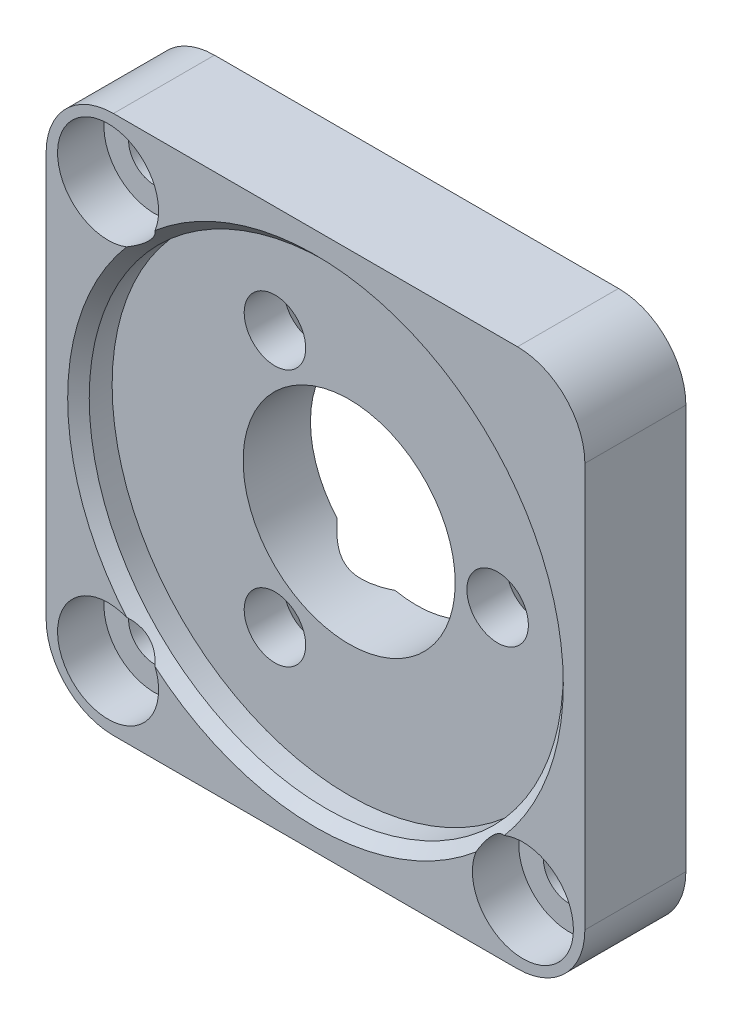
ISO-10303-21;
HEADER;
FILE_DESCRIPTION(('STEP AP214'),'2;1');
FILE_NAME('part.step','',(''),(''),'','','');
FILE_SCHEMA(('AUTOMOTIVE_DESIGN { 1 0 10303 214 1 1 1 1 }'));
ENDSEC;
DATA;
#1=APPLICATION_CONTEXT('core data for automotive mechanical design processes');
#2=APPLICATION_PROTOCOL_DEFINITION('international standard','automotive_design',2000,#1);
#3=PRODUCT_CONTEXT('',#1,'mechanical');
#4=PRODUCT('Part','Part','',(#3));
#5=PRODUCT_RELATED_PRODUCT_CATEGORY('part','',(#4));
#6=PRODUCT_DEFINITION_FORMATION('','',#4);
#7=PRODUCT_DEFINITION_CONTEXT('part definition',#1,'design');
#8=PRODUCT_DEFINITION('design','',#6,#7);
#9=PRODUCT_DEFINITION_SHAPE('','',#8);
#10=(LENGTH_UNIT() NAMED_UNIT(*) SI_UNIT(.MILLI.,.METRE.));
#11=(NAMED_UNIT(*) PLANE_ANGLE_UNIT() SI_UNIT($,.RADIAN.));
#12=(NAMED_UNIT(*) SI_UNIT($,.STERADIAN.) SOLID_ANGLE_UNIT());
#13=UNCERTAINTY_MEASURE_WITH_UNIT(LENGTH_MEASURE(1.E-05),#10,'distance_accuracy_value','');
#14=(GEOMETRIC_REPRESENTATION_CONTEXT(3) GLOBAL_UNCERTAINTY_ASSIGNED_CONTEXT((#13)) GLOBAL_UNIT_ASSIGNED_CONTEXT((#10,
#11,#12)) REPRESENTATION_CONTEXT('',''));
#15=CARTESIAN_POINT('',(0.,0.,0.));
#16=DIRECTION('',(0.,0.,1.));
#17=DIRECTION('',(1.,0.,0.));
#18=AXIS2_PLACEMENT_3D('',#15,#16,#17);
#19=CARTESIAN_POINT('',(0.,0.,0.));
#20=DIRECTION('',(0.,0.,1.));
#21=DIRECTION('',(1.,0.,0.));
#22=AXIS2_PLACEMENT_3D('',#19,#20,#21);
#23=CYLINDRICAL_SURFACE('',#22,5.);
#24=CARTESIAN_POINT('',(0.,0.,0.));
#25=DIRECTION('',(0.,0.,1.));
#26=DIRECTION('',(1.,0.,0.));
#27=AXIS2_PLACEMENT_3D('',#24,#25,#26);
#28=CIRCLE('',#27,5.);
#29=CARTESIAN_POINT('',(4.7455357142857,1.57476689844525,0.));
#30=VERTEX_POINT('',#29);
#31=CARTESIAN_POINT('',(-1.00897971805046,4.89713793236037,0.));
#32=VERTEX_POINT('',#31);
#33=EDGE_CURVE('E153',#30,#32,#28,.T.);
#34=ORIENTED_EDGE('',*,*,#33,.F.);
#35=CARTESIAN_POINT('',(4.74545713999999,1.57500366108245,-0.00020000000000202));
#36=CARTESIAN_POINT('',(4.76552764029645,1.51449201081971,0.050857437708633));
#37=CARTESIAN_POINT('',(4.7846905441715,1.45292141588944,0.101081569057024));
#38=CARTESIAN_POINT('',(4.82113131529227,1.32704022235563,0.199208084636068));
#39=CARTESIAN_POINT('',(4.83840194452243,1.26272032746794,0.247101189452153));
#40=CARTESIAN_POINT('',(4.87129986426245,1.12928597912404,0.340836981811573));
#41=CARTESIAN_POINT('',(4.88686630182077,1.06008712899437,0.386582349971828));
#42=CARTESIAN_POINT('',(4.91550203129823,0.918188654262139,0.472977295465216));
#43=CARTESIAN_POINT('',(4.92857514537635,0.845494605395758,0.51363463908094));
#44=CARTESIAN_POINT('',(4.95280341966186,0.690211548889723,0.590753024415545));
#45=CARTESIAN_POINT('',(4.96372916996901,0.607293104967135,0.626638669126483));
#46=CARTESIAN_POINT('',(4.98156782915352,0.437249254180743,0.68627598239686));
#47=CARTESIAN_POINT('',(4.98851001775224,0.350159777885404,0.710116028591315));
#48=CARTESIAN_POINT('',(4.99551452281616,0.216523557129883,0.73434653523121));
#49=CARTESIAN_POINT('',(4.99728125103068,0.171084235238875,0.740503371873505));
#50=CARTESIAN_POINT('',(4.99957142855513,0.079787252951217,0.74849613308357));
#51=CARTESIAN_POINT('',(5.00009499863555,0.0339296336259222,0.750332477379014));
#52=CARTESIAN_POINT('',(4.99987663666279,-0.0577475674176241,0.749568247437993));
#53=CARTESIAN_POINT('',(4.99913463306999,-0.103567146839095,0.746967422379725));
#54=CARTESIAN_POINT('',(4.99641515830057,-0.194735342049909,0.737487055591618));
#55=CARTESIAN_POINT('',(4.99443700942246,-0.240083685616463,0.730605166830416));
#56=CARTESIAN_POINT('',(4.98613850030061,-0.385337562601037,0.701961111322438));
#57=CARTESIAN_POINT('',(4.97747133271156,-0.483592924539697,0.672313168311543));
#58=CARTESIAN_POINT('',(4.95523473097507,-0.674574721890798,0.598711818835299));
#59=CARTESIAN_POINT('',(4.9416241272002,-0.767246870771934,0.554638590636629));
#60=CARTESIAN_POINT('',(4.91453775100104,-0.922920975830143,0.470138280685812));
#61=CARTESIAN_POINT('',(4.90198195816715,-0.987277891700082,0.431839748716554));
#62=CARTESIAN_POINT('',(4.87491803739937,-1.11325216235572,0.351508884111785));
#63=CARTESIAN_POINT('',(4.86040828407791,-1.17486717892545,0.309473452965235));
#64=CARTESIAN_POINT('',(4.83001826870802,-1.29406695461802,0.223831671961862));
#65=CARTESIAN_POINT('',(4.81418441437144,-1.35171521044422,0.180296292882237));
#66=CARTESIAN_POINT('',(4.78096475207525,-1.46486295912579,0.0913365391103757));
#67=CARTESIAN_POINT('',(4.76358245335927,-1.52036692163019,0.0459165544142633));
#68=CARTESIAN_POINT('',(4.74545714000001,-1.57500366108238,-0.000200000000000358));
#69=B_SPLINE_CURVE_WITH_KNOTS('',3,(#35,#36,#37,#38,#39,#40,#41,#42,#43,#44,#45,#46,#47,#48,#49,
#50,#51,#52,#53,#54,#55,#56,#57,#58,#59,#60,#61,#62,#63,#64,#65,#66,#67,#68),.UNSPECIFIED.,.F.,
.F.,(4,2,2,2,2,2,2,2,2,2,2,2,2,2,2,2,4),(0.,0.245079278068307,0.491065475204198,
0.74406131750005,0.996666154522853,1.26899156999665,1.53928883597289,1.6767603437754,
1.81421849592898,1.95168441849679,2.08922577127056,2.39629939428319,2.70599131704176,
2.93361902569863,3.16143726809206,3.38322900447651,3.60453029505814),.UNSPECIFIED.);
#70=CARTESIAN_POINT('',(4.74553571428573,-1.57476689844518,0.));
#71=VERTEX_POINT('',#70);
#72=EDGE_CURVE('E139',#30,#71,#69,.T.);
#73=ORIENTED_EDGE('',*,*,#72,.T.);
#74=CARTESIAN_POINT('',(-1.00897971805046,-4.89713793236037,0.));
#75=VERTEX_POINT('',#74);
#76=EDGE_CURVE('E156',#75,#71,#28,.T.);
#77=ORIENTED_EDGE('',*,*,#76,.F.);
#78=CARTESIAN_POINT('',(-1.0087353884491,-4.89718826635146,-0.000200000000020371));
#79=CARTESIAN_POINT('',(-1.07117526494978,-4.88431400434349,0.0508574377086147));
#80=CARTESIAN_POINT('',(-1.13407841622304,-4.87012426844443,0.101081569057007));
#81=CARTESIAN_POINT('',(-1.26131511324242,-4.8387423052016,0.199208084636052));
#82=CARTESIAN_POINT('',(-1.32565309079897,-4.82153916141042,0.247101189452138));
#83=CARTESIAN_POINT('',(-1.45765958607223,-4.78331242146499,0.340836981811559));
#84=CARTESIAN_POINT('',(-1.52537076697635,-4.76219392677208,0.386582349971815));
#85=CARTESIAN_POINT('',(-1.66257631559146,-4.71604395858935,0.472977295465204));
#86=CARTESIAN_POINT('',(-1.73206776565276,-4.69101858305438,0.513634639080929));
#87=CARTESIAN_POINT('',(-1.87866097450703,-4.63435935582247,0.590753024415536));
#88=CARTESIAN_POINT('',(-1.95593332853984,-4.60236211118257,0.626638669126476));
#89=CARTESIAN_POINT('',(-2.11211495267044,-4.53278891781262,0.686275982396854));
#90=CARTESIAN_POINT('',(-2.19100774584385,-4.49525629134929,0.71011602859131));
#91=CARTESIAN_POINT('',(-2.31024236041584,-4.43450426029783,0.734346535231206));
#92=CARTESIAN_POINT('',(-2.35047733161145,-4.41331463086769,0.740503371873502));
#93=CARTESIAN_POINT('',(-2.43068792632364,-4.3696494916392,0.748496133083569));
#94=CARTESIAN_POINT('',(-2.47066357465664,-4.34717410696686,0.750332477379013));
#95=CARTESIAN_POINT('',(-2.54994917872182,-4.30114639942946,0.749568247437993));
#96=CARTESIAN_POINT('',(-2.58925909669513,-4.27759401575765,0.746967422379726));
#97=CARTESIAN_POINT('',(-2.66685333238017,-4.22965478391698,0.73748705559162));
#98=CARTESIAN_POINT('',(-2.7051370754893,-4.20526748495279,0.730605166830417));
#99=CARTESIAN_POINT('',(-2.82678136839519,-4.12545382674744,0.701961111322439));
#100=CARTESIAN_POINT('',(-2.90753942409758,-4.06882015846714,0.672313168311545));
#101=CARTESIAN_POINT('',(-3.0618162113958,-3.95407179779395,0.598711818835303));
#102=CARTESIAN_POINT('',(-3.13526734466272,-3.8959485947235,0.554638590636633));
#103=CARTESIAN_POINT('',(-3.25654188625496,-3.79465405230946,0.470138280685815));
#104=CARTESIAN_POINT('',(-3.3059987138906,-3.75160195881569,0.431839748716555));
#105=CARTESIAN_POINT('',(-3.40156367211772,-3.66517678057695,0.351508884111781));
#106=CARTESIAN_POINT('',(-3.44766896506098,-3.62180345731305,0.309473452965228));
#107=CARTESIAN_POINT('',(-3.53570399125121,-3.53588504413504,0.223831671961849));
#108=CARTESIAN_POINT('',(-3.57771191811228,-3.49334839612664,0.180296292882222));
#109=CARTESIAN_POINT('',(-3.65909091170344,-3.40800545033221,0.0913365391103537));
#110=CARTESIAN_POINT('',(-3.69846760388496,-3.36519995681579,0.0459165544142379));
#111=CARTESIAN_POINT('',(-3.73672175155088,-3.32218460526902,-0.000200000000029382));
#112=B_SPLINE_CURVE_WITH_KNOTS('',3,(#78,#79,#80,#81,#82,#83,#84,#85,#86,#87,#88,#89,#90,#91,
#92,#93,#94,#95,#96,#97,#98,#99,#100,#101,#102,#103,#104,#105,#106,#107,#108,#109,#110,#111),
.UNSPECIFIED.,.F.,.F.,(4,2,2,2,2,2,2,2,2,2,2,2,2,2,2,2,4),(0.,0.245079278068308,
0.491065475204202,0.744061317500056,0.996666154522861,1.26899156999667,1.5392888359729,
1.67676034377542,1.81421849592899,1.9516844184968,2.08922577127058,2.39629939428321,
2.70599131704178,2.93361902569865,3.1614372680921,3.38322900447656,3.60453029505821),.UNSPECIFIED.);
#113=CARTESIAN_POINT('',(-3.73655599623524,-3.32237103391516,0.));
#114=VERTEX_POINT('',#113);
#115=EDGE_CURVE('E148',#75,#114,#112,.T.);
#116=ORIENTED_EDGE('',*,*,#115,.T.);
#117=CARTESIAN_POINT('',(-3.73655599623524,3.32237103391516,0.));
#118=VERTEX_POINT('',#117);
#119=EDGE_CURVE('E166',#118,#114,#28,.T.);
#120=ORIENTED_EDGE('',*,*,#119,.F.);
#121=CARTESIAN_POINT('',(-3.73672175155088,3.32218460526902,-0.000200000000029231));
#122=CARTESIAN_POINT('',(-3.69435237534666,3.36982199352379,0.0508574377086064));
#123=CARTESIAN_POINT('',(-3.65061212794845,3.417202852555,0.101081569056999));
#124=CARTESIAN_POINT('',(-3.55981620204985,3.51170208284599,0.199208084636045));
#125=CARTESIAN_POINT('',(-3.51274885372345,3.55881883394249,0.247101189452131));
#126=CARTESIAN_POINT('',(-3.41364027819021,3.65402644234096,0.340836981811553));
#127=CARTESIAN_POINT('',(-3.36149553484441,3.70210679777773,0.386582349971809));
#128=CARTESIAN_POINT('',(-3.25292571570676,3.79785530432722,0.4729772954652));
#129=CARTESIAN_POINT('',(-3.19650737972359,3.84552397765864,0.513634639080924));
#130=CARTESIAN_POINT('',(-3.07414244515482,3.94414780693276,0.590753024415532));
#131=CARTESIAN_POINT('',(-3.00779584142916,3.99506900621545,0.626638669126473));
#132=CARTESIAN_POINT('',(-2.86945287648307,4.09553966363189,0.686275982396852));
#133=CARTESIAN_POINT('',(-2.79750227190837,4.14509651346391,0.710116028591308));
#134=CARTESIAN_POINT('',(-2.68527216240031,4.21798070316796,0.734346535231205));
#135=CARTESIAN_POINT('',(-2.64680391941922,4.24223039562883,0.740503371873501));
#136=CARTESIAN_POINT('',(-2.56888350223147,4.289862238688,0.748496133083569));
#137=CARTESIAN_POINT('',(-2.5294314239789,4.31324447334095,0.750332477379014));
#138=CARTESIAN_POINT('',(-2.44992745794096,4.3588939668471,0.749568247437994));
#139=CARTESIAN_POINT('',(-2.40987553637484,4.38116116259677,0.746967422379727));
#140=CARTESIAN_POINT('',(-2.32956182592039,4.42439012596691,0.737487055591621));
#141=CARTESIAN_POINT('',(-2.28929993393315,4.44535117056928,0.730605166830419));
#142=CARTESIAN_POINT('',(-2.1593571319054,4.5107913893485,0.701961111322442));
#143=CARTESIAN_POINT('',(-2.06993190861397,4.55241308300686,0.672313168311549));
#144=CARTESIAN_POINT('',(-1.89341851957926,4.62864651968477,0.598711818835308));
#145=CARTESIAN_POINT('',(-1.80635678253746,4.66319546549545,0.554638590636638));
#146=CARTESIAN_POINT('',(-1.65799586474606,4.71757502813962,0.470138280685821));
#147=CARTESIAN_POINT('',(-1.59598324427653,4.73887985051579,0.431839748716561));
#148=CARTESIAN_POINT('',(-1.47335436528163,4.7784289429327,0.351508884111788));
#149=CARTESIAN_POINT('',(-1.41273931901691,4.79667063623854,0.309473452965235));
#150=CARTESIAN_POINT('',(-1.29431427745679,4.82995199875311,0.223831671961857));
#151=CARTESIAN_POINT('',(-1.23647249625914,4.84506360657091,0.180296292882229));
#152=CARTESIAN_POINT('',(-1.12187384037178,4.87286840945805,0.0913365391103621));
#153=CARTESIAN_POINT('',(-1.06511484947427,4.88556687844604,0.0459165544142466));
#154=CARTESIAN_POINT('',(-1.0087353884491,4.89718826635146,-0.000200000000020631));
#155=B_SPLINE_CURVE_WITH_KNOTS('',3,(#121,#122,#123,#124,#125,#126,#127,#128,#129,#130,#131,
#132,#133,#134,#135,#136,#137,#138,#139,#140,#141,#142,#143,#144,#145,#146,#147,#148,#149,#150,
#151,#152,#153,#154),.UNSPECIFIED.,.F.,.F.,(4,2,2,2,2,2,2,2,2,2,2,2,2,2,2,2,4),(0.,
0.24507927806831,0.491065475204204,0.744061317500059,0.996666154522866,1.26899156999667,
1.53928883597291,1.67676034377542,1.814218495929,1.95168441849681,2.08922577127058,
2.39629939428321,2.70599131704178,2.93361902569866,3.16143726809211,3.38322900447657,
3.60453029505821),.UNSPECIFIED.);
#156=EDGE_CURVE('E163',#118,#32,#155,.T.);
#157=ORIENTED_EDGE('',*,*,#156,.T.);
#158=EDGE_LOOP('',(#34,#73,#77,#116,#120,#157));
#159=FACE_BOUND('',#158,.T.);
#160=CARTESIAN_POINT('',(0.,0.,3.175));
#161=DIRECTION('',(0.,0.,1.));
#162=DIRECTION('',(1.,0.,0.));
#163=AXIS2_PLACEMENT_3D('',#160,#161,#162);
#164=CIRCLE('',#163,5.);
#165=CARTESIAN_POINT('',(5.,0.,3.175));
#166=VERTEX_POINT('',#165);
#167=EDGE_CURVE('E158',#166,#166,#164,.F.);
#168=ORIENTED_EDGE('',*,*,#167,.F.);
#169=EDGE_LOOP('',(#168));
#170=FACE_BOUND('',#169,.T.);
#171=ADVANCED_FACE('F35',(#159,#170),#23,.F.);
#172=CARTESIAN_POINT('',(-3.49999999999998,6.06217782649108,0.));
#173=DIRECTION('',(0.,0.,-1.));
#174=DIRECTION('',(-1.,0.,0.));
#175=AXIS2_PLACEMENT_3D('',#172,#173,#174);
#176=CYLINDRICAL_SURFACE('',#175,1.44999999999999);
#177=CARTESIAN_POINT('',(-3.49999999999998,6.06217782649108,1.30000000000001));
#178=DIRECTION('',(0.,0.,-1.));
#179=DIRECTION('',(-1.,0.,0.));
#180=AXIS2_PLACEMENT_3D('',#177,#178,#179);
#181=CIRCLE('',#180,1.44999999999999);
#182=CARTESIAN_POINT('',(-4.94999999999998,6.06217782649108,1.30000000000001));
#183=VERTEX_POINT('',#182);
#184=EDGE_CURVE('E164',#183,#183,#181,.T.);
#185=ORIENTED_EDGE('',*,*,#184,.T.);
#186=EDGE_LOOP('',(#185));
#187=FACE_BOUND('',#186,.T.);
#188=CARTESIAN_POINT('',(-3.49999999999998,6.06217782649108,3.175));
#189=DIRECTION('',(0.,0.,1.));
#190=DIRECTION('',(1.,0.,0.));
#191=AXIS2_PLACEMENT_3D('',#188,#189,#190);
#192=CIRCLE('',#191,1.44999999999999);
#193=CARTESIAN_POINT('',(-2.04999999999999,6.06217782649108,3.175));
#194=VERTEX_POINT('',#193);
#195=EDGE_CURVE('E225',#194,#194,#192,.F.);
#196=ORIENTED_EDGE('',*,*,#195,.F.);
#197=EDGE_LOOP('',(#196));
#198=FACE_BOUND('',#197,.T.);
#199=ADVANCED_FACE('F210',(#187,#198),#176,.F.);
#200=CARTESIAN_POINT('',(-3.49999999999999,-6.06217782649108,0.));
#201=DIRECTION('',(0.,0.,-1.));
#202=DIRECTION('',(-1.,0.,0.));
#203=AXIS2_PLACEMENT_3D('',#200,#201,#202);
#204=CYLINDRICAL_SURFACE('',#203,1.44999999999999);
#205=CARTESIAN_POINT('',(-3.49999999999999,-6.06217782649108,1.30000000000001));
#206=DIRECTION('',(0.,0.,-1.));
#207=DIRECTION('',(-1.,0.,0.));
#208=AXIS2_PLACEMENT_3D('',#205,#206,#207);
#209=CIRCLE('',#208,1.44999999999999);
#210=CARTESIAN_POINT('',(-4.94999999999998,-6.06217782649108,1.30000000000001));
#211=VERTEX_POINT('',#210);
#212=EDGE_CURVE('E240',#211,#211,#209,.T.);
#213=ORIENTED_EDGE('',*,*,#212,.T.);
#214=EDGE_LOOP('',(#213));
#215=FACE_BOUND('',#214,.T.);
#216=CARTESIAN_POINT('',(-3.49999999999999,-6.06217782649108,3.175));
#217=DIRECTION('',(0.,0.,1.));
#218=DIRECTION('',(1.,0.,0.));
#219=AXIS2_PLACEMENT_3D('',#216,#217,#218);
#220=CIRCLE('',#219,1.44999999999999);
#221=CARTESIAN_POINT('',(-2.04999999999999,-6.06217782649108,3.175));
#222=VERTEX_POINT('',#221);
#223=EDGE_CURVE('E227',#222,#222,#220,.F.);
#224=ORIENTED_EDGE('',*,*,#223,.F.);
#225=EDGE_LOOP('',(#224));
#226=FACE_BOUND('',#225,.T.);
#227=ADVANCED_FACE('F212',(#215,#226),#204,.F.);
#228=CARTESIAN_POINT('',(7.,0.,0.));
#229=DIRECTION('',(0.,0.,-1.));
#230=DIRECTION('',(-1.,0.,0.));
#231=AXIS2_PLACEMENT_3D('',#228,#229,#230);
#232=CYLINDRICAL_SURFACE('',#231,1.44999999999999);
#233=CARTESIAN_POINT('',(7.,0.,1.30000000000001));
#234=DIRECTION('',(0.,0.,-1.));
#235=DIRECTION('',(-1.,0.,0.));
#236=AXIS2_PLACEMENT_3D('',#233,#234,#235);
#237=CIRCLE('',#236,1.44999999999999);
#238=CARTESIAN_POINT('',(5.55000000000001,0.,1.30000000000001));
#239=VERTEX_POINT('',#238);
#240=EDGE_CURVE('E157',#239,#239,#237,.T.);
#241=ORIENTED_EDGE('',*,*,#240,.T.);
#242=EDGE_LOOP('',(#241));
#243=FACE_BOUND('',#242,.T.);
#244=CARTESIAN_POINT('',(7.,0.,3.175));
#245=DIRECTION('',(0.,0.,1.));
#246=DIRECTION('',(1.,0.,0.));
#247=AXIS2_PLACEMENT_3D('',#244,#245,#246);
#248=CIRCLE('',#247,1.44999999999999);
#249=CARTESIAN_POINT('',(8.45,0.,3.175));
#250=VERTEX_POINT('',#249);
#251=EDGE_CURVE('E232',#250,#250,#248,.F.);
#252=ORIENTED_EDGE('',*,*,#251,.F.);
#253=EDGE_LOOP('',(#252));
#254=FACE_BOUND('',#253,.T.);
#255=ADVANCED_FACE('F218',(#243,#254),#232,.F.);
#256=CARTESIAN_POINT('',(0.,-28.0814213562373,0.));
#257=DIRECTION('',(0.,0.,1.));
#258=DIRECTION('',(1.,0.,0.));
#259=AXIS2_PLACEMENT_3D('',#256,#257,#258);
#260=PLANE('',#259);
#261=DIRECTION('',(1.,0.,0.));
#262=VECTOR('',#261,1.);
#263=CARTESIAN_POINT('',(0.,12.7,0.));
#264=LINE('',#263,#262);
#265=CARTESIAN_POINT('',(-9.525,12.7,0.));
#266=VERTEX_POINT('',#265);
#267=CARTESIAN_POINT('',(9.525,12.7,0.));
#268=VERTEX_POINT('',#267);
#269=EDGE_CURVE('E172',#266,#268,#264,.T.);
#270=ORIENTED_EDGE('',*,*,#269,.T.);
#271=CARTESIAN_POINT('',(9.525,9.525,0.));
#272=DIRECTION('',(0.,0.,1.));
#273=DIRECTION('',(1.,0.,0.));
#274=AXIS2_PLACEMENT_3D('',#271,#272,#273);
#275=CIRCLE('',#274,3.175);
#276=CARTESIAN_POINT('',(12.7,9.52500000000001,0.));
#277=VERTEX_POINT('',#276);
#278=EDGE_CURVE('E462',#268,#277,#275,.F.);
#279=ORIENTED_EDGE('',*,*,#278,.T.);
#280=DIRECTION('',(0.,1.,0.));
#281=VECTOR('',#280,1.);
#282=CARTESIAN_POINT('',(12.7,-28.0814213562373,0.));
#283=LINE('',#282,#281);
#284=CARTESIAN_POINT('',(12.7,-9.525,0.));
#285=VERTEX_POINT('',#284);
#286=EDGE_CURVE('E187',#285,#277,#283,.T.);
#287=ORIENTED_EDGE('',*,*,#286,.F.);
#288=CARTESIAN_POINT('',(9.52500000000001,-9.525,0.));
#289=DIRECTION('',(0.,0.,1.));
#290=DIRECTION('',(1.,0.,0.));
#291=AXIS2_PLACEMENT_3D('',#288,#289,#290);
#292=CIRCLE('',#291,3.175);
#293=CARTESIAN_POINT('',(9.52500000000001,-12.7,0.));
#294=VERTEX_POINT('',#293);
#295=EDGE_CURVE('E463',#285,#294,#292,.F.);
#296=ORIENTED_EDGE('',*,*,#295,.T.);
#297=DIRECTION('',(1.,0.,0.));
#298=VECTOR('',#297,1.);
#299=CARTESIAN_POINT('',(0.,-12.7,0.));
#300=LINE('',#299,#298);
#301=CARTESIAN_POINT('',(-9.52499999999999,-12.7,0.));
#302=VERTEX_POINT('',#301);
#303=EDGE_CURVE('E179',#302,#294,#300,.T.);
#304=ORIENTED_EDGE('',*,*,#303,.F.);
#305=CARTESIAN_POINT('',(-9.52499999999999,-9.525,0.));
#306=DIRECTION('',(0.,0.,1.));
#307=DIRECTION('',(1.,0.,0.));
#308=AXIS2_PLACEMENT_3D('',#305,#306,#307);
#309=CIRCLE('',#308,3.175);
#310=CARTESIAN_POINT('',(-12.7,-9.525,0.));
#311=VERTEX_POINT('',#310);
#312=EDGE_CURVE('E464',#302,#311,#309,.F.);
#313=ORIENTED_EDGE('',*,*,#312,.T.);
#314=DIRECTION('',(0.,1.,0.));
#315=VECTOR('',#314,1.);
#316=CARTESIAN_POINT('',(-12.7,-28.0814213562373,0.));
#317=LINE('',#316,#315);
#318=CARTESIAN_POINT('',(-12.7,9.525,0.));
#319=VERTEX_POINT('',#318);
#320=EDGE_CURVE('E174',#311,#319,#317,.T.);
#321=ORIENTED_EDGE('',*,*,#320,.T.);
#322=CARTESIAN_POINT('',(-9.525,9.525,0.));
#323=DIRECTION('',(0.,0.,1.));
#324=DIRECTION('',(1.,0.,0.));
#325=AXIS2_PLACEMENT_3D('',#322,#323,#324);
#326=CIRCLE('',#325,3.175);
#327=EDGE_CURVE('E468',#319,#266,#326,.F.);
#328=ORIENTED_EDGE('',*,*,#327,.T.);
#329=EDGE_LOOP('',(#270,#279,#287,#296,#304,#313,#321,#328));
#330=FACE_BOUND('',#329,.T.);
#331=CARTESIAN_POINT('',(-9.77900000000001,9.779,0.));
#332=DIRECTION('',(0.,0.,1.));
#333=DIRECTION('',(1.,0.,0.));
#334=AXIS2_PLACEMENT_3D('',#331,#332,#333);
#335=CIRCLE('',#334,1.2192);
#336=CARTESIAN_POINT('',(-8.55980000000001,9.779,0.));
#337=VERTEX_POINT('',#336);
#338=EDGE_CURVE('E275',#337,#337,#335,.T.);
#339=ORIENTED_EDGE('',*,*,#338,.T.);
#340=EDGE_LOOP('',(#339));
#341=FACE_BOUND('',#340,.T.);
#342=CARTESIAN_POINT('',(9.77899999999999,-9.779,0.));
#343=DIRECTION('',(0.,0.,1.));
#344=DIRECTION('',(1.,0.,0.));
#345=AXIS2_PLACEMENT_3D('',#342,#343,#344);
#346=CIRCLE('',#345,1.2192);
#347=CARTESIAN_POINT('',(10.9982,-9.779,0.));
#348=VERTEX_POINT('',#347);
#349=EDGE_CURVE('E264',#348,#348,#346,.T.);
#350=ORIENTED_EDGE('',*,*,#349,.T.);
#351=EDGE_LOOP('',(#350));
#352=FACE_BOUND('',#351,.T.);
#353=CARTESIAN_POINT('',(-9.77900000000001,-9.779,0.));
#354=DIRECTION('',(0.,0.,1.));
#355=DIRECTION('',(1.,0.,0.));
#356=AXIS2_PLACEMENT_3D('',#353,#354,#355);
#357=CIRCLE('',#356,1.2192);
#358=CARTESIAN_POINT('',(-8.55980000000001,-9.779,0.));
#359=VERTEX_POINT('',#358);
#360=EDGE_CURVE('E252',#359,#359,#357,.T.);
#361=ORIENTED_EDGE('',*,*,#360,.T.);
#362=EDGE_LOOP('',(#361));
#363=FACE_BOUND('',#362,.T.);
#364=CARTESIAN_POINT('',(7.,0.,0.));
#365=DIRECTION('',(0.,0.,-1.));
#366=DIRECTION('',(-1.,0.,0.));
#367=AXIS2_PLACEMENT_3D('',#364,#365,#366);
#368=CIRCLE('',#367,2.75);
#369=EDGE_CURVE('E142',#30,#71,#368,.T.);
#370=ORIENTED_EDGE('',*,*,#369,.F.);
#371=ORIENTED_EDGE('',*,*,#33,.T.);
#372=CARTESIAN_POINT('',(-3.49999999999998,6.06217782649108,0.));
#373=DIRECTION('',(0.,0.,-1.));
#374=DIRECTION('',(-1.,0.,0.));
#375=AXIS2_PLACEMENT_3D('',#372,#373,#374);
#376=CIRCLE('',#375,2.75);
#377=EDGE_CURVE('E168',#118,#32,#376,.T.);
#378=ORIENTED_EDGE('',*,*,#377,.F.);
#379=ORIENTED_EDGE('',*,*,#119,.T.);
#380=CARTESIAN_POINT('',(-3.49999999999999,-6.06217782649108,0.));
#381=DIRECTION('',(0.,0.,-1.));
#382=DIRECTION('',(-1.,0.,0.));
#383=AXIS2_PLACEMENT_3D('',#380,#381,#382);
#384=CIRCLE('',#383,2.75);
#385=EDGE_CURVE('E238',#75,#114,#384,.T.);
#386=ORIENTED_EDGE('',*,*,#385,.F.);
#387=ORIENTED_EDGE('',*,*,#76,.T.);
#388=EDGE_LOOP('',(#370,#371,#378,#379,#386,#387));
#389=FACE_BOUND('',#388,.T.);
#390=ADVANCED_FACE('F151',(#330,#341,#352,#363,#389),#260,.F.);
#391=CARTESIAN_POINT('',(0.,12.7,4.7625));
#392=DIRECTION('',(0.,1.,0.));
#393=DIRECTION('',(0.,0.,1.));
#394=AXIS2_PLACEMENT_3D('',#391,#392,#393);
#395=PLANE('',#394);
#396=DIRECTION('',(1.,0.,0.));
#397=VECTOR('',#396,1.);
#398=CARTESIAN_POINT('',(0.,12.7,4.7625));
#399=LINE('',#398,#397);
#400=CARTESIAN_POINT('',(-9.525,12.7,4.7625));
#401=VERTEX_POINT('',#400);
#402=CARTESIAN_POINT('',(9.525,12.7,4.7625));
#403=VERTEX_POINT('',#402);
#404=EDGE_CURVE('E190',#401,#403,#399,.T.);
#405=ORIENTED_EDGE('',*,*,#404,.T.);
#406=DIRECTION('',(0.,0.,-1.));
#407=VECTOR('',#406,1.);
#408=CARTESIAN_POINT('',(9.525,12.7,0.));
#409=LINE('',#408,#407);
#410=EDGE_CURVE('E457',#403,#268,#409,.T.);
#411=ORIENTED_EDGE('',*,*,#410,.T.);
#412=ORIENTED_EDGE('',*,*,#269,.F.);
#413=DIRECTION('',(0.,0.,-1.));
#414=VECTOR('',#413,1.);
#415=CARTESIAN_POINT('',(-9.525,12.7,4.7625));
#416=LINE('',#415,#414);
#417=EDGE_CURVE('E197',#266,#401,#416,.F.);
#418=ORIENTED_EDGE('',*,*,#417,.T.);
#419=EDGE_LOOP('',(#405,#411,#412,#418));
#420=FACE_BOUND('',#419,.T.);
#421=ADVANCED_FACE('F384',(#420),#395,.T.);
#422=CARTESIAN_POINT('',(-12.7,-28.0814213562373,4.7625));
#423=DIRECTION('',(-1.,0.,0.));
#424=DIRECTION('',(0.,0.,1.));
#425=AXIS2_PLACEMENT_3D('',#422,#423,#424);
#426=PLANE('',#425);
#427=DIRECTION('',(0.,1.,0.));
#428=VECTOR('',#427,1.);
#429=CARTESIAN_POINT('',(-12.7,-28.0814213562373,4.7625));
#430=LINE('',#429,#428);
#431=CARTESIAN_POINT('',(-12.7,-9.525,4.7625));
#432=VERTEX_POINT('',#431);
#433=CARTESIAN_POINT('',(-12.7,9.525,4.7625));
#434=VERTEX_POINT('',#433);
#435=EDGE_CURVE('E450',#432,#434,#430,.T.);
#436=ORIENTED_EDGE('',*,*,#435,.T.);
#437=DIRECTION('',(0.,0.,-1.));
#438=VECTOR('',#437,1.);
#439=CARTESIAN_POINT('',(-12.7,9.525,4.7625));
#440=LINE('',#439,#438);
#441=EDGE_CURVE('E442',#434,#319,#440,.T.);
#442=ORIENTED_EDGE('',*,*,#441,.T.);
#443=ORIENTED_EDGE('',*,*,#320,.F.);
#444=DIRECTION('',(0.,0.,-1.));
#445=VECTOR('',#444,1.);
#446=CARTESIAN_POINT('',(-12.7,-9.525,4.7625));
#447=LINE('',#446,#445);
#448=EDGE_CURVE('E440',#311,#432,#447,.F.);
#449=ORIENTED_EDGE('',*,*,#448,.T.);
#450=EDGE_LOOP('',(#436,#442,#443,#449));
#451=FACE_BOUND('',#450,.T.);
#452=ADVANCED_FACE('F389',(#451),#426,.T.);
#453=CARTESIAN_POINT('',(0.,-12.7,4.7625));
#454=DIRECTION('',(0.,1.,0.));
#455=DIRECTION('',(0.,0.,1.));
#456=AXIS2_PLACEMENT_3D('',#453,#454,#455);
#457=PLANE('',#456);
#458=DIRECTION('',(1.,0.,0.));
#459=VECTOR('',#458,1.);
#460=CARTESIAN_POINT('',(0.,-12.7,4.7625));
#461=LINE('',#460,#459);
#462=CARTESIAN_POINT('',(-9.52499999999999,-12.7,4.7625));
#463=VERTEX_POINT('',#462);
#464=CARTESIAN_POINT('',(9.52500000000001,-12.7,4.7625));
#465=VERTEX_POINT('',#464);
#466=EDGE_CURVE('E445',#463,#465,#461,.T.);
#467=ORIENTED_EDGE('',*,*,#466,.F.);
#468=DIRECTION('',(0.,0.,-1.));
#469=VECTOR('',#468,1.);
#470=CARTESIAN_POINT('',(-9.52499999999999,-12.7,0.));
#471=LINE('',#470,#469);
#472=EDGE_CURVE('E281',#463,#302,#471,.T.);
#473=ORIENTED_EDGE('',*,*,#472,.T.);
#474=ORIENTED_EDGE('',*,*,#303,.T.);
#475=DIRECTION('',(0.,0.,-1.));
#476=VECTOR('',#475,1.);
#477=CARTESIAN_POINT('',(9.52500000000001,-12.7,4.7625));
#478=LINE('',#477,#476);
#479=EDGE_CURVE('E284',#294,#465,#478,.F.);
#480=ORIENTED_EDGE('',*,*,#479,.T.);
#481=EDGE_LOOP('',(#467,#473,#474,#480));
#482=FACE_BOUND('',#481,.T.);
#483=ADVANCED_FACE('F397',(#482),#457,.F.);
#484=CARTESIAN_POINT('',(12.7,-28.0814213562373,4.7625));
#485=DIRECTION('',(-1.,0.,0.));
#486=DIRECTION('',(0.,0.,1.));
#487=AXIS2_PLACEMENT_3D('',#484,#485,#486);
#488=PLANE('',#487);
#489=ORIENTED_EDGE('',*,*,#286,.T.);
#490=DIRECTION('',(0.,0.,-1.));
#491=VECTOR('',#490,1.);
#492=CARTESIAN_POINT('',(12.7,9.525,4.7625));
#493=LINE('',#492,#491);
#494=CARTESIAN_POINT('',(12.7,9.52500000000001,4.7625));
#495=VERTEX_POINT('',#494);
#496=EDGE_CURVE('E430',#277,#495,#493,.F.);
#497=ORIENTED_EDGE('',*,*,#496,.T.);
#498=DIRECTION('',(0.,1.,0.));
#499=VECTOR('',#498,1.);
#500=CARTESIAN_POINT('',(12.7,-28.0814213562373,4.7625));
#501=LINE('',#500,#499);
#502=CARTESIAN_POINT('',(12.7,-9.525,4.7625));
#503=VERTEX_POINT('',#502);
#504=EDGE_CURVE('E182',#503,#495,#501,.T.);
#505=ORIENTED_EDGE('',*,*,#504,.F.);
#506=DIRECTION('',(0.,0.,-1.));
#507=VECTOR('',#506,1.);
#508=CARTESIAN_POINT('',(12.7,-9.525,4.7625));
#509=LINE('',#508,#507);
#510=EDGE_CURVE('E424',#503,#285,#509,.T.);
#511=ORIENTED_EDGE('',*,*,#510,.T.);
#512=EDGE_LOOP('',(#489,#497,#505,#511));
#513=FACE_BOUND('',#512,.T.);
#514=ADVANCED_FACE('F394',(#513),#488,.F.);
#515=CARTESIAN_POINT('',(0.,-28.0814213562373,4.7625));
#516=DIRECTION('',(0.,0.,1.));
#517=DIRECTION('',(1.,0.,0.));
#518=AXIS2_PLACEMENT_3D('',#515,#516,#517);
#519=PLANE('',#518);
#520=CARTESIAN_POINT('',(9.77899999999999,-9.779,4.7625));
#521=DIRECTION('',(0.,0.,1.));
#522=DIRECTION('',(1.,0.,0.));
#523=AXIS2_PLACEMENT_3D('',#520,#521,#522);
#524=CIRCLE('',#523,2.38125);
#525=CARTESIAN_POINT('',(7.56382383049486,-8.90530319872592,4.7625));
#526=VERTEX_POINT('',#525);
#527=CARTESIAN_POINT('',(8.90530319872591,-7.56382383049487,4.7625));
#528=VERTEX_POINT('',#527);
#529=EDGE_CURVE('E255',#526,#528,#524,.T.);
#530=ORIENTED_EDGE('',*,*,#529,.F.);
#531=CARTESIAN_POINT('',(0.,0.,4.7625));
#532=DIRECTION('',(0.,0.,1.));
#533=DIRECTION('',(1.,0.,0.));
#534=AXIS2_PLACEMENT_3D('',#531,#532,#533);
#535=CIRCLE('',#534,11.684);
#536=CARTESIAN_POINT('',(-7.56382383049488,-8.9053031987259,4.7625));
#537=VERTEX_POINT('',#536);
#538=EDGE_CURVE('E317',#526,#537,#535,.F.);
#539=ORIENTED_EDGE('',*,*,#538,.T.);
#540=CARTESIAN_POINT('',(-9.77900000000001,-9.779,4.7625));
#541=DIRECTION('',(0.,0.,1.));
#542=DIRECTION('',(1.,0.,0.));
#543=AXIS2_PLACEMENT_3D('',#540,#541,#542);
#544=CIRCLE('',#543,2.38125);
#545=CARTESIAN_POINT('',(-8.90530319872591,-7.56382383049487,4.7625));
#546=VERTEX_POINT('',#545);
#547=EDGE_CURVE('E243',#546,#537,#544,.T.);
#548=ORIENTED_EDGE('',*,*,#547,.F.);
#549=CARTESIAN_POINT('',(0.,0.,4.7625));
#550=DIRECTION('',(0.,0.,1.));
#551=DIRECTION('',(1.,0.,0.));
#552=AXIS2_PLACEMENT_3D('',#549,#550,#551);
#553=CIRCLE('',#552,11.684);
#554=CARTESIAN_POINT('',(-8.90530319872591,7.56382383049487,4.7625));
#555=VERTEX_POINT('',#554);
#556=EDGE_CURVE('E60',#546,#555,#553,.F.);
#557=ORIENTED_EDGE('',*,*,#556,.T.);
#558=CARTESIAN_POINT('',(-9.77900000000001,9.779,4.7625));
#559=DIRECTION('',(0.,0.,1.));
#560=DIRECTION('',(1.,0.,0.));
#561=AXIS2_PLACEMENT_3D('',#558,#559,#560);
#562=CIRCLE('',#561,2.38125);
#563=CARTESIAN_POINT('',(-7.56382383049488,8.9053031987259,4.7625));
#564=VERTEX_POINT('',#563);
#565=EDGE_CURVE('E267',#564,#555,#562,.T.);
#566=ORIENTED_EDGE('',*,*,#565,.F.);
#567=CARTESIAN_POINT('',(0.,0.,4.7625));
#568=DIRECTION('',(0.,0.,1.));
#569=DIRECTION('',(1.,0.,0.));
#570=AXIS2_PLACEMENT_3D('',#567,#568,#569);
#571=CIRCLE('',#570,11.684);
#572=EDGE_CURVE('E345',#564,#528,#571,.F.);
#573=ORIENTED_EDGE('',*,*,#572,.T.);
#574=EDGE_LOOP('',(#530,#539,#548,#557,#566,#573));
#575=FACE_BOUND('',#574,.T.);
#576=ORIENTED_EDGE('',*,*,#504,.T.);
#577=CARTESIAN_POINT('',(9.525,9.525,4.7625));
#578=DIRECTION('',(0.,0.,1.));
#579=DIRECTION('',(1.,0.,0.));
#580=AXIS2_PLACEMENT_3D('',#577,#578,#579);
#581=CIRCLE('',#580,3.175);
#582=EDGE_CURVE('E438',#495,#403,#581,.T.);
#583=ORIENTED_EDGE('',*,*,#582,.T.);
#584=ORIENTED_EDGE('',*,*,#404,.F.);
#585=CARTESIAN_POINT('',(-9.525,9.525,4.7625));
#586=DIRECTION('',(0.,0.,1.));
#587=DIRECTION('',(1.,0.,0.));
#588=AXIS2_PLACEMENT_3D('',#585,#586,#587);
#589=CIRCLE('',#588,3.175);
#590=EDGE_CURVE('E432',#401,#434,#589,.T.);
#591=ORIENTED_EDGE('',*,*,#590,.T.);
#592=ORIENTED_EDGE('',*,*,#435,.F.);
#593=CARTESIAN_POINT('',(-9.52499999999999,-9.525,4.7625));
#594=DIRECTION('',(0.,0.,1.));
#595=DIRECTION('',(1.,0.,0.));
#596=AXIS2_PLACEMENT_3D('',#593,#594,#595);
#597=CIRCLE('',#596,3.175);
#598=EDGE_CURVE('E429',#432,#463,#597,.T.);
#599=ORIENTED_EDGE('',*,*,#598,.T.);
#600=ORIENTED_EDGE('',*,*,#466,.T.);
#601=CARTESIAN_POINT('',(9.52500000000001,-9.525,4.7625));
#602=DIRECTION('',(0.,0.,1.));
#603=DIRECTION('',(1.,0.,0.));
#604=AXIS2_PLACEMENT_3D('',#601,#602,#603);
#605=CIRCLE('',#604,3.175);
#606=EDGE_CURVE('E422',#465,#503,#605,.T.);
#607=ORIENTED_EDGE('',*,*,#606,.T.);
#608=EDGE_LOOP('',(#576,#583,#584,#591,#592,#599,#600,#607));
#609=FACE_BOUND('',#608,.T.);
#610=ADVANCED_FACE('F207',(#575,#609),#519,.T.);
#611=CARTESIAN_POINT('',(-3.49999999999998,6.06217782649108,0.));
#612=DIRECTION('',(0.,0.,-1.));
#613=DIRECTION('',(-1.,0.,0.));
#614=AXIS2_PLACEMENT_3D('',#611,#612,#613);
#615=CONICAL_SURFACE('',#614,2.75,0.785398163397447);
#616=ORIENTED_EDGE('',*,*,#184,.F.);
#617=EDGE_LOOP('',(#616));
#618=FACE_BOUND('',#617,.T.);
#619=ORIENTED_EDGE('',*,*,#377,.T.);
#620=ORIENTED_EDGE('',*,*,#156,.F.);
#621=EDGE_LOOP('',(#619,#620));
#622=FACE_BOUND('',#621,.T.);
#623=ADVANCED_FACE('F202',(#618,#622),#615,.F.);
#624=CARTESIAN_POINT('',(-9.77900000000001,9.779,4.7625));
#625=DIRECTION('',(0.,0.,1.));
#626=DIRECTION('',(1.,0.,0.));
#627=AXIS2_PLACEMENT_3D('',#624,#625,#626);
#628=CYLINDRICAL_SURFACE('',#627,1.2192);
#629=ORIENTED_EDGE('',*,*,#338,.F.);
#630=EDGE_LOOP('',(#629));
#631=FACE_BOUND('',#630,.T.);
#632=CARTESIAN_POINT('',(-9.77900000000001,9.779,2.5781));
#633=DIRECTION('',(0.,0.,1.));
#634=DIRECTION('',(1.,0.,0.));
#635=AXIS2_PLACEMENT_3D('',#632,#633,#634);
#636=CIRCLE('',#635,1.2192);
#637=CARTESIAN_POINT('',(-8.5598,9.779,2.5781));
#638=VERTEX_POINT('',#637);
#639=EDGE_CURVE('E272',#638,#638,#636,.T.);
#640=ORIENTED_EDGE('',*,*,#639,.T.);
#641=EDGE_LOOP('',(#640));
#642=FACE_BOUND('',#641,.T.);
#643=ADVANCED_FACE('F206',(#631,#642),#628,.F.);
#644=CARTESIAN_POINT('',(-8.5598,9.779,2.5781));
#645=DIRECTION('',(0.,0.,-1.));
#646=DIRECTION('',(-1.,0.,0.));
#647=AXIS2_PLACEMENT_3D('',#644,#645,#646);
#648=PLANE('',#647);
#649=ORIENTED_EDGE('',*,*,#639,.F.);
#650=EDGE_LOOP('',(#649));
#651=FACE_BOUND('',#650,.T.);
#652=CARTESIAN_POINT('',(-9.77900000000001,9.779,2.5781));
#653=DIRECTION('',(0.,0.,1.));
#654=DIRECTION('',(1.,0.,0.));
#655=AXIS2_PLACEMENT_3D('',#652,#653,#654);
#656=CIRCLE('',#655,2.38125);
#657=CARTESIAN_POINT('',(-7.39775,9.779,2.5781));
#658=VERTEX_POINT('',#657);
#659=EDGE_CURVE('E269',#658,#658,#656,.T.);
#660=ORIENTED_EDGE('',*,*,#659,.T.);
#661=EDGE_LOOP('',(#660));
#662=FACE_BOUND('',#661,.T.);
#663=ADVANCED_FACE('F328',(#651,#662),#648,.F.);
#664=CARTESIAN_POINT('',(-9.77900000000001,9.779,4.7625));
#665=DIRECTION('',(0.,0.,1.));
#666=DIRECTION('',(1.,0.,0.));
#667=AXIS2_PLACEMENT_3D('',#664,#665,#666);
#668=CYLINDRICAL_SURFACE('',#667,2.38125);
#669=ORIENTED_EDGE('',*,*,#659,.F.);
#670=EDGE_LOOP('',(#669));
#671=FACE_BOUND('',#670,.T.);
#672=ORIENTED_EDGE('',*,*,#565,.T.);
#673=CARTESIAN_POINT('',(-8.90530319872591,7.56382383049487,4.7625));
#674=CARTESIAN_POINT('',(-8.8659085689401,7.57936363489392,4.74253477848426));
#675=CARTESIAN_POINT('',(-8.82651185128811,7.59611590452138,4.72353094713165));
#676=CARTESIAN_POINT('',(-8.74784457805624,7.63215379824849,4.68767731781849));
#677=CARTESIAN_POINT('',(-8.70857418911248,7.65144195207684,4.67082970440631));
#678=CARTESIAN_POINT('',(-8.59090100088422,7.7134158406586,4.62377993218056));
#679=CARTESIAN_POINT('',(-8.51300910376746,7.76006699948981,4.59726302559434));
#680=CARTESIAN_POINT('',(-8.36056001267877,7.86407518793927,4.55606611129206));
#681=CARTESIAN_POINT('',(-8.28602547135463,7.9214943935448,4.54145762469331));
#682=CARTESIAN_POINT('',(-8.14377352721471,8.04543821743746,4.525828969334));
#683=CARTESIAN_POINT('',(-8.07603239847728,8.11192908435668,4.52475974943834));
#684=CARTESIAN_POINT('',(-7.95444795780102,8.24637373303286,4.53574047494963));
#685=CARTESIAN_POINT('',(-7.89993320924919,8.3138104921347,4.54677539952571));
#686=CARTESIAN_POINT('',(-7.79948900508145,8.45263370947139,4.57945421196323));
#687=CARTESIAN_POINT('',(-7.75358176410756,8.52402978777494,4.6011250424248));
#688=CARTESIAN_POINT('',(-7.68298134710057,8.64739311654419,4.64580180652871));
#689=CARTESIAN_POINT('',(-7.65601452926441,8.69891984023308,4.66655369944543));
#690=CARTESIAN_POINT('',(-7.60662110556973,8.80207959470624,4.71183789584258));
#691=CARTESIAN_POINT('',(-7.5841695819836,8.85371035939859,4.73634805771326));
#692=CARTESIAN_POINT('',(-7.56382383049488,8.9053031987259,4.7625));
#693=B_SPLINE_CURVE_WITH_KNOTS('',3,(#673,#674,#675,#676,#677,#678,#679,#680,#681,#682,#683,
#684,#685,#686,#687,#688,#689,#690,#691,#692),.UNSPECIFIED.,.F.,.F.,(4,2,2,2,2,2,2,2,2,4),(0.,
0.140410993095487,0.280963134496107,0.563385158813946,0.847491145238054,1.13056755411453,
1.39160266293533,1.653302458896,1.83827879515819,2.02220449476008),.UNSPECIFIED.);
#694=EDGE_CURVE('E48',#555,#564,#693,.T.);
#695=ORIENTED_EDGE('',*,*,#694,.T.);
#696=EDGE_LOOP('',(#672,#695));
#697=FACE_BOUND('',#696,.T.);
#698=ADVANCED_FACE('F323',(#671,#697),#668,.F.);
#699=CARTESIAN_POINT('',(9.77899999999999,-9.779,4.7625));
#700=DIRECTION('',(0.,0.,1.));
#701=DIRECTION('',(1.,0.,0.));
#702=AXIS2_PLACEMENT_3D('',#699,#700,#701);
#703=CYLINDRICAL_SURFACE('',#702,1.2192);
#704=ORIENTED_EDGE('',*,*,#349,.F.);
#705=EDGE_LOOP('',(#704));
#706=FACE_BOUND('',#705,.T.);
#707=CARTESIAN_POINT('',(9.77899999999999,-9.779,2.5781));
#708=DIRECTION('',(0.,0.,1.));
#709=DIRECTION('',(1.,0.,0.));
#710=AXIS2_PLACEMENT_3D('',#707,#708,#709);
#711=CIRCLE('',#710,1.2192);
#712=CARTESIAN_POINT('',(10.9982,-9.779,2.5781));
#713=VERTEX_POINT('',#712);
#714=EDGE_CURVE('E261',#713,#713,#711,.T.);
#715=ORIENTED_EDGE('',*,*,#714,.T.);
#716=EDGE_LOOP('',(#715));
#717=FACE_BOUND('',#716,.T.);
#718=ADVANCED_FACE('F327',(#706,#717),#703,.F.);
#719=CARTESIAN_POINT('',(10.9982,-9.779,2.5781));
#720=DIRECTION('',(0.,0.,-1.));
#721=DIRECTION('',(-1.,0.,0.));
#722=AXIS2_PLACEMENT_3D('',#719,#720,#721);
#723=PLANE('',#722);
#724=ORIENTED_EDGE('',*,*,#714,.F.);
#725=EDGE_LOOP('',(#724));
#726=FACE_BOUND('',#725,.T.);
#727=CARTESIAN_POINT('',(9.77899999999999,-9.779,2.5781));
#728=DIRECTION('',(0.,0.,1.));
#729=DIRECTION('',(1.,0.,0.));
#730=AXIS2_PLACEMENT_3D('',#727,#728,#729);
#731=CIRCLE('',#730,2.38125);
#732=CARTESIAN_POINT('',(12.16025,-9.779,2.5781));
#733=VERTEX_POINT('',#732);
#734=EDGE_CURVE('E258',#733,#733,#731,.T.);
#735=ORIENTED_EDGE('',*,*,#734,.T.);
#736=EDGE_LOOP('',(#735));
#737=FACE_BOUND('',#736,.T.);
#738=ADVANCED_FACE('F483',(#726,#737),#723,.F.);
#739=CARTESIAN_POINT('',(9.77899999999999,-9.779,4.7625));
#740=DIRECTION('',(0.,0.,1.));
#741=DIRECTION('',(1.,0.,0.));
#742=AXIS2_PLACEMENT_3D('',#739,#740,#741);
#743=CYLINDRICAL_SURFACE('',#742,2.38125);
#744=ORIENTED_EDGE('',*,*,#734,.F.);
#745=EDGE_LOOP('',(#744));
#746=FACE_BOUND('',#745,.T.);
#747=ORIENTED_EDGE('',*,*,#529,.T.);
#748=CARTESIAN_POINT('',(8.90530319872591,-7.56382383049487,4.7625));
#749=CARTESIAN_POINT('',(8.86590856894011,-7.57936363489391,4.74253477848425));
#750=CARTESIAN_POINT('',(8.82651185128812,-7.59611590452138,4.72353094713165));
#751=CARTESIAN_POINT('',(8.74784457805625,-7.63215379824849,4.68767731781849));
#752=CARTESIAN_POINT('',(8.70857418911249,-7.65144195207683,4.67082970440631));
#753=CARTESIAN_POINT('',(8.59090100088423,-7.7134158406586,4.62377993218056));
#754=CARTESIAN_POINT('',(8.51300910376746,-7.7600669994898,4.59726302559433));
#755=CARTESIAN_POINT('',(8.36056001267877,-7.86407518793926,4.55606611129205));
#756=CARTESIAN_POINT('',(8.28602547135463,-7.92149439354479,4.5414576246933));
#757=CARTESIAN_POINT('',(8.14377352721471,-8.04543821743746,4.525828969334));
#758=CARTESIAN_POINT('',(8.07603239847728,-8.11192908435667,4.52475974943833));
#759=CARTESIAN_POINT('',(7.95444795780101,-8.24637373303285,4.53574047494962));
#760=CARTESIAN_POINT('',(7.89993320924918,-8.31381049213469,4.54677539952569));
#761=CARTESIAN_POINT('',(7.79948900508145,-8.45263370947138,4.57945421196322));
#762=CARTESIAN_POINT('',(7.75358176410756,-8.52402978777493,4.60112504242479));
#763=CARTESIAN_POINT('',(7.68298134710056,-8.64739311654418,4.6458018065287));
#764=CARTESIAN_POINT('',(7.6560145292644,-8.69891984023308,4.66655369944542));
#765=CARTESIAN_POINT('',(7.60662110556972,-8.80207959470624,4.71183789584258));
#766=CARTESIAN_POINT('',(7.58416958198358,-8.8537103593986,4.73634805771326));
#767=CARTESIAN_POINT('',(7.56382383049486,-8.90530319872592,4.7625));
#768=B_SPLINE_CURVE_WITH_KNOTS('',3,(#748,#749,#750,#751,#752,#753,#754,#755,#756,#757,#758,
#759,#760,#761,#762,#763,#764,#765,#766,#767),.UNSPECIFIED.,.F.,.F.,(4,2,2,2,2,2,2,2,2,4),(0.,
0.140410993095487,0.280963134496106,0.56338515881395,0.847491145238059,1.13056755411454,
1.39160266293534,1.653302458896,1.83827879515821,2.02220449476011),.UNSPECIFIED.);
#769=EDGE_CURVE('E11',#528,#526,#768,.T.);
#770=ORIENTED_EDGE('',*,*,#769,.T.);
#771=EDGE_LOOP('',(#747,#770));
#772=FACE_BOUND('',#771,.T.);
#773=ADVANCED_FACE('F480',(#746,#772),#743,.F.);
#774=CARTESIAN_POINT('',(-9.77900000000001,-9.779,4.7625));
#775=DIRECTION('',(0.,0.,1.));
#776=DIRECTION('',(1.,0.,0.));
#777=AXIS2_PLACEMENT_3D('',#774,#775,#776);
#778=CYLINDRICAL_SURFACE('',#777,1.2192);
#779=ORIENTED_EDGE('',*,*,#360,.F.);
#780=EDGE_LOOP('',(#779));
#781=FACE_BOUND('',#780,.T.);
#782=CARTESIAN_POINT('',(-9.77900000000001,-9.779,2.5781));
#783=DIRECTION('',(0.,0.,1.));
#784=DIRECTION('',(1.,0.,0.));
#785=AXIS2_PLACEMENT_3D('',#782,#783,#784);
#786=CIRCLE('',#785,1.2192);
#787=CARTESIAN_POINT('',(-8.5598,-9.779,2.5781));
#788=VERTEX_POINT('',#787);
#789=EDGE_CURVE('E249',#788,#788,#786,.T.);
#790=ORIENTED_EDGE('',*,*,#789,.T.);
#791=EDGE_LOOP('',(#790));
#792=FACE_BOUND('',#791,.T.);
#793=ADVANCED_FACE('F482',(#781,#792),#778,.F.);
#794=CARTESIAN_POINT('',(-8.5598,-9.779,2.5781));
#795=DIRECTION('',(0.,0.,-1.));
#796=DIRECTION('',(-1.,0.,0.));
#797=AXIS2_PLACEMENT_3D('',#794,#795,#796);
#798=PLANE('',#797);
#799=ORIENTED_EDGE('',*,*,#789,.F.);
#800=EDGE_LOOP('',(#799));
#801=FACE_BOUND('',#800,.T.);
#802=CARTESIAN_POINT('',(-9.77900000000001,-9.779,2.5781));
#803=DIRECTION('',(0.,0.,1.));
#804=DIRECTION('',(1.,0.,0.));
#805=AXIS2_PLACEMENT_3D('',#802,#803,#804);
#806=CIRCLE('',#805,2.38125);
#807=CARTESIAN_POINT('',(-7.39775,-9.779,2.5781));
#808=VERTEX_POINT('',#807);
#809=EDGE_CURVE('E246',#808,#808,#806,.T.);
#810=ORIENTED_EDGE('',*,*,#809,.T.);
#811=EDGE_LOOP('',(#810));
#812=FACE_BOUND('',#811,.T.);
#813=ADVANCED_FACE('F308',(#801,#812),#798,.F.);
#814=CARTESIAN_POINT('',(-9.77900000000001,-9.779,4.7625));
#815=DIRECTION('',(0.,0.,1.));
#816=DIRECTION('',(1.,0.,0.));
#817=AXIS2_PLACEMENT_3D('',#814,#815,#816);
#818=CYLINDRICAL_SURFACE('',#817,2.38125);
#819=ORIENTED_EDGE('',*,*,#809,.F.);
#820=EDGE_LOOP('',(#819));
#821=FACE_BOUND('',#820,.T.);
#822=ORIENTED_EDGE('',*,*,#547,.T.);
#823=CARTESIAN_POINT('',(-7.56382383049488,-8.9053031987259,4.7625));
#824=CARTESIAN_POINT('',(-7.57936363489392,-8.8659085689401,4.74253477848426));
#825=CARTESIAN_POINT('',(-7.59611590452139,-8.8265118512881,4.72353094713165));
#826=CARTESIAN_POINT('',(-7.6321537982485,-8.74784457805623,4.68767731781849));
#827=CARTESIAN_POINT('',(-7.65144195207684,-8.70857418911248,4.67082970440631));
#828=CARTESIAN_POINT('',(-7.71341584065861,-8.59090100088422,4.62377993218056));
#829=CARTESIAN_POINT('',(-7.76006699948982,-8.51300910376746,4.59726302559433));
#830=CARTESIAN_POINT('',(-7.86407518793927,-8.36056001267877,4.55606611129206));
#831=CARTESIAN_POINT('',(-7.9214943935448,-8.28602547135463,4.54145762469331));
#832=CARTESIAN_POINT('',(-8.04543821743747,-8.1437735272147,4.525828969334));
#833=CARTESIAN_POINT('',(-8.11192908435669,-8.07603239847728,4.52475974943834));
#834=CARTESIAN_POINT('',(-8.24637373303287,-7.95444795780101,4.53574047494962));
#835=CARTESIAN_POINT('',(-8.31381049213471,-7.89993320924918,4.54677539952571));
#836=CARTESIAN_POINT('',(-8.4526337094714,-7.79948900508145,4.57945421196323));
#837=CARTESIAN_POINT('',(-8.52402978777495,-7.75358176410755,4.6011250424248));
#838=CARTESIAN_POINT('',(-8.64739311654419,-7.68298134710057,4.64580180652871));
#839=CARTESIAN_POINT('',(-8.69891984023309,-7.65601452926441,4.66655369944543));
#840=CARTESIAN_POINT('',(-8.80207959470624,-7.60662110556973,4.71183789584258));
#841=CARTESIAN_POINT('',(-8.85371035939859,-7.58416958198359,4.73634805771326));
#842=CARTESIAN_POINT('',(-8.90530319872591,-7.56382383049487,4.7625));
#843=B_SPLINE_CURVE_WITH_KNOTS('',3,(#823,#824,#825,#826,#827,#828,#829,#830,#831,#832,#833,
#834,#835,#836,#837,#838,#839,#840,#841,#842),.UNSPECIFIED.,.F.,.F.,(4,2,2,2,2,2,2,2,2,4),(0.,
0.140410993095489,0.280963134496109,0.563385158813948,0.847491145238056,1.13056755411454,
1.39160266293533,1.653302458896,1.83827879515819,2.02220449476008),.UNSPECIFIED.);
#844=EDGE_CURVE('E312',#537,#546,#843,.T.);
#845=ORIENTED_EDGE('',*,*,#844,.T.);
#846=EDGE_LOOP('',(#822,#845));
#847=FACE_BOUND('',#846,.T.);
#848=ADVANCED_FACE('F303',(#821,#847),#818,.F.);
#849=CARTESIAN_POINT('',(9.525,9.525,4.7625));
#850=DIRECTION('',(0.,0.,1.));
#851=DIRECTION('',(1.,0.,0.));
#852=AXIS2_PLACEMENT_3D('',#849,#850,#851);
#853=CYLINDRICAL_SURFACE('',#852,3.175);
#854=ORIENTED_EDGE('',*,*,#582,.F.);
#855=ORIENTED_EDGE('',*,*,#496,.F.);
#856=ORIENTED_EDGE('',*,*,#278,.F.);
#857=ORIENTED_EDGE('',*,*,#410,.F.);
#858=EDGE_LOOP('',(#854,#855,#856,#857));
#859=FACE_BOUND('',#858,.T.);
#860=ADVANCED_FACE('F307',(#859),#853,.T.);
#861=CARTESIAN_POINT('',(-9.525,9.525,4.7625));
#862=DIRECTION('',(0.,0.,-1.));
#863=DIRECTION('',(-1.,0.,0.));
#864=AXIS2_PLACEMENT_3D('',#861,#862,#863);
#865=CYLINDRICAL_SURFACE('',#864,3.175);
#866=ORIENTED_EDGE('',*,*,#590,.F.);
#867=ORIENTED_EDGE('',*,*,#417,.F.);
#868=ORIENTED_EDGE('',*,*,#327,.F.);
#869=ORIENTED_EDGE('',*,*,#441,.F.);
#870=EDGE_LOOP('',(#866,#867,#868,#869));
#871=FACE_BOUND('',#870,.T.);
#872=ADVANCED_FACE('F407',(#871),#865,.T.);
#873=CARTESIAN_POINT('',(-9.52499999999999,-9.525,4.7625));
#874=DIRECTION('',(0.,0.,1.));
#875=DIRECTION('',(1.,0.,0.));
#876=AXIS2_PLACEMENT_3D('',#873,#874,#875);
#877=CYLINDRICAL_SURFACE('',#876,3.175);
#878=ORIENTED_EDGE('',*,*,#598,.F.);
#879=ORIENTED_EDGE('',*,*,#448,.F.);
#880=ORIENTED_EDGE('',*,*,#312,.F.);
#881=ORIENTED_EDGE('',*,*,#472,.F.);
#882=EDGE_LOOP('',(#878,#879,#880,#881));
#883=FACE_BOUND('',#882,.T.);
#884=ADVANCED_FACE('F411',(#883),#877,.T.);
#885=CARTESIAN_POINT('',(9.52500000000001,-9.525,4.7625));
#886=DIRECTION('',(0.,0.,-1.));
#887=DIRECTION('',(-1.,0.,0.));
#888=AXIS2_PLACEMENT_3D('',#885,#886,#887);
#889=CYLINDRICAL_SURFACE('',#888,3.175);
#890=ORIENTED_EDGE('',*,*,#606,.F.);
#891=ORIENTED_EDGE('',*,*,#479,.F.);
#892=ORIENTED_EDGE('',*,*,#295,.F.);
#893=ORIENTED_EDGE('',*,*,#510,.F.);
#894=EDGE_LOOP('',(#890,#891,#892,#893));
#895=FACE_BOUND('',#894,.T.);
#896=ADVANCED_FACE('F300',(#895),#889,.T.);
#897=CARTESIAN_POINT('',(-3.49999999999999,-6.06217782649108,0.));
#898=DIRECTION('',(0.,0.,-1.));
#899=DIRECTION('',(-1.,0.,0.));
#900=AXIS2_PLACEMENT_3D('',#897,#898,#899);
#901=CONICAL_SURFACE('',#900,2.75,0.785398163397447);
#902=ORIENTED_EDGE('',*,*,#212,.F.);
#903=EDGE_LOOP('',(#902));
#904=FACE_BOUND('',#903,.T.);
#905=ORIENTED_EDGE('',*,*,#385,.T.);
#906=ORIENTED_EDGE('',*,*,#115,.F.);
#907=EDGE_LOOP('',(#905,#906));
#908=FACE_BOUND('',#907,.T.);
#909=ADVANCED_FACE('F296',(#904,#908),#901,.F.);
#910=CARTESIAN_POINT('',(7.,0.,0.));
#911=DIRECTION('',(0.,0.,-1.));
#912=DIRECTION('',(-1.,0.,0.));
#913=AXIS2_PLACEMENT_3D('',#910,#911,#912);
#914=CONICAL_SURFACE('',#913,2.75,0.785398163397447);
#915=ORIENTED_EDGE('',*,*,#240,.F.);
#916=EDGE_LOOP('',(#915));
#917=FACE_BOUND('',#916,.T.);
#918=ORIENTED_EDGE('',*,*,#369,.T.);
#919=ORIENTED_EDGE('',*,*,#72,.F.);
#920=EDGE_LOOP('',(#918,#919));
#921=FACE_BOUND('',#920,.T.);
#922=ADVANCED_FACE('F141',(#917,#921),#914,.F.);
#923=CARTESIAN_POINT('',(0.,0.,3.175));
#924=DIRECTION('',(0.,0.,1.));
#925=DIRECTION('',(1.,0.,0.));
#926=AXIS2_PLACEMENT_3D('',#923,#924,#925);
#927=PLANE('',#926);
#928=ORIENTED_EDGE('',*,*,#195,.T.);
#929=EDGE_LOOP('',(#928));
#930=FACE_BOUND('',#929,.T.);
#931=ORIENTED_EDGE('',*,*,#251,.T.);
#932=EDGE_LOOP('',(#931));
#933=FACE_BOUND('',#932,.T.);
#934=CARTESIAN_POINT('',(0.,0.,3.175));
#935=DIRECTION('',(0.,0.,1.));
#936=DIRECTION('',(1.,0.,0.));
#937=AXIS2_PLACEMENT_3D('',#934,#935,#936);
#938=CIRCLE('',#937,11.176);
#939=CARTESIAN_POINT('',(11.176,0.,3.175));
#940=VERTEX_POINT('',#939);
#941=EDGE_CURVE('E352',#940,#940,#938,.T.);
#942=ORIENTED_EDGE('',*,*,#941,.T.);
#943=EDGE_LOOP('',(#942));
#944=FACE_BOUND('',#943,.T.);
#945=ORIENTED_EDGE('',*,*,#223,.T.);
#946=EDGE_LOOP('',(#945));
#947=FACE_BOUND('',#946,.T.);
#948=ORIENTED_EDGE('',*,*,#167,.T.);
#949=EDGE_LOOP('',(#948));
#950=FACE_BOUND('',#949,.T.);
#951=ADVANCED_FACE('F358',(#930,#933,#944,#947,#950),#927,.T.);
#952=CARTESIAN_POINT('',(0.,0.,3.175));
#953=DIRECTION('',(0.,0.,1.));
#954=DIRECTION('',(1.,0.,0.));
#955=AXIS2_PLACEMENT_3D('',#952,#953,#954);
#956=CYLINDRICAL_SURFACE('',#955,11.176);
#957=CARTESIAN_POINT('',(0.,0.,4.2545));
#958=DIRECTION('',(0.,0.,1.));
#959=DIRECTION('',(1.,0.,0.));
#960=AXIS2_PLACEMENT_3D('',#957,#958,#959);
#961=CIRCLE('',#960,11.176);
#962=CARTESIAN_POINT('',(11.176,0.,4.2545));
#963=VERTEX_POINT('',#962);
#964=EDGE_CURVE('E147',#963,#963,#961,.T.);
#965=ORIENTED_EDGE('',*,*,#964,.T.);
#966=EDGE_LOOP('',(#965));
#967=FACE_BOUND('',#966,.T.);
#968=ORIENTED_EDGE('',*,*,#941,.F.);
#969=EDGE_LOOP('',(#968));
#970=FACE_BOUND('',#969,.T.);
#971=ADVANCED_FACE('F361',(#967,#970),#956,.F.);
#972=CARTESIAN_POINT('',(0.,0.,4.2545));
#973=DIRECTION('',(0.,0.,1.));
#974=DIRECTION('',(1.,0.,0.));
#975=AXIS2_PLACEMENT_3D('',#972,#973,#974);
#976=CONICAL_SURFACE('',#975,11.176,0.785398163397445);
#977=ORIENTED_EDGE('',*,*,#844,.F.);
#978=ORIENTED_EDGE('',*,*,#538,.F.);
#979=ORIENTED_EDGE('',*,*,#769,.F.);
#980=ORIENTED_EDGE('',*,*,#572,.F.);
#981=ORIENTED_EDGE('',*,*,#694,.F.);
#982=ORIENTED_EDGE('',*,*,#556,.F.);
#983=EDGE_LOOP('',(#977,#978,#979,#980,#981,#982));
#984=FACE_BOUND('',#983,.T.);
#985=ORIENTED_EDGE('',*,*,#964,.F.);
#986=EDGE_LOOP('',(#985));
#987=FACE_BOUND('',#986,.T.);
#988=ADVANCED_FACE('F37',(#984,#987),#976,.F.);
#989=CLOSED_SHELL('',(#171,#199,#227,#255,#390,#421,#452,#483,#514,#610,#623,#643,#663,#698,
#718,#738,#773,#793,#813,#848,#860,#872,#884,#896,#909,#922,#951,#971,#988));
#990=MANIFOLD_SOLID_BREP('B2',#989);
#991=ADVANCED_BREP_SHAPE_REPRESENTATION('',(#18,#990),#14);
#992=SHAPE_DEFINITION_REPRESENTATION(#9,#991);
ENDSEC;
END-ISO-10303-21;
